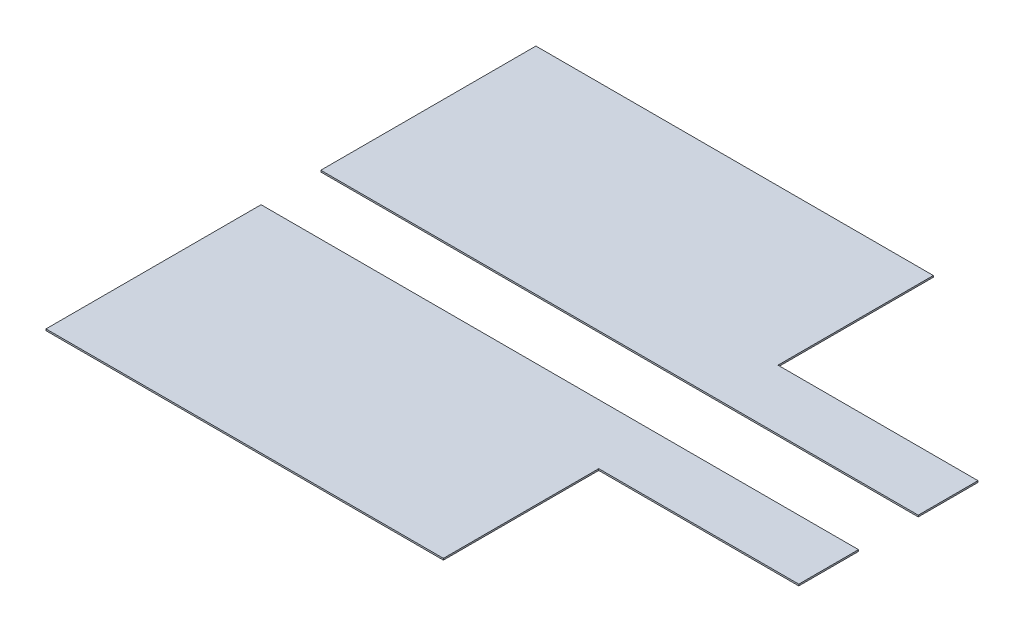
ISO-10303-21;
HEADER;
FILE_DESCRIPTION(('STEP AP214'),'2;1');
FILE_NAME('part.step','',(''),(''),'','','');
FILE_SCHEMA(('AUTOMOTIVE_DESIGN { 1 0 10303 214 1 1 1 1 }'));
ENDSEC;
DATA;
#1=APPLICATION_CONTEXT('core data for automotive mechanical design processes');
#2=APPLICATION_PROTOCOL_DEFINITION('international standard','automotive_design',2000,#1);
#3=PRODUCT_CONTEXT('',#1,'mechanical');
#4=PRODUCT('Part','Part','',(#3));
#5=PRODUCT_RELATED_PRODUCT_CATEGORY('part','',(#4));
#6=PRODUCT_DEFINITION_FORMATION('','',#4);
#7=PRODUCT_DEFINITION_CONTEXT('part definition',#1,'design');
#8=PRODUCT_DEFINITION('design','',#6,#7);
#9=PRODUCT_DEFINITION_SHAPE('','',#8);
#10=(LENGTH_UNIT() NAMED_UNIT(*) SI_UNIT(.MILLI.,.METRE.));
#11=(NAMED_UNIT(*) PLANE_ANGLE_UNIT() SI_UNIT($,.RADIAN.));
#12=(NAMED_UNIT(*) SI_UNIT($,.STERADIAN.) SOLID_ANGLE_UNIT());
#13=UNCERTAINTY_MEASURE_WITH_UNIT(LENGTH_MEASURE(1.E-05),#10,'distance_accuracy_value','');
#14=(GEOMETRIC_REPRESENTATION_CONTEXT(3) GLOBAL_UNCERTAINTY_ASSIGNED_CONTEXT((#13)) GLOBAL_UNIT_ASSIGNED_CONTEXT((#10,
#11,#12)) REPRESENTATION_CONTEXT('',''));
#15=CARTESIAN_POINT('',(0.,0.,0.));
#16=DIRECTION('',(0.,0.,1.));
#17=DIRECTION('',(1.,0.,0.));
#18=AXIS2_PLACEMENT_3D('',#15,#16,#17);
#19=CARTESIAN_POINT('',(0.,0.0666,10.25));
#20=DIRECTION('',(1.,0.,0.));
#21=DIRECTION('',(0.,0.,-1.));
#22=AXIS2_PLACEMENT_3D('',#19,#20,#21);
#23=PLANE('',#22);
#24=DIRECTION('',(0.,0.,1.));
#25=VECTOR('',#24,1.);
#26=CARTESIAN_POINT('',(0.,0.,10.25));
#27=LINE('',#26,#25);
#28=CARTESIAN_POINT('',(0.,0.,1.25));
#29=VERTEX_POINT('',#28);
#30=CARTESIAN_POINT('',(0.,0.,10.25));
#31=VERTEX_POINT('',#30);
#32=EDGE_CURVE('E133',#29,#31,#27,.T.);
#33=ORIENTED_EDGE('',*,*,#32,.T.);
#34=DIRECTION('',(0.,-1.,0.));
#35=VECTOR('',#34,1.);
#36=CARTESIAN_POINT('',(0.,0.0666,10.25));
#37=LINE('',#36,#35);
#38=CARTESIAN_POINT('',(0.,0.0666,10.25));
#39=VERTEX_POINT('',#38);
#40=EDGE_CURVE('E12',#39,#31,#37,.T.);
#41=ORIENTED_EDGE('',*,*,#40,.F.);
#42=DIRECTION('',(0.,0.,1.));
#43=VECTOR('',#42,1.);
#44=CARTESIAN_POINT('',(0.,0.0666,10.25));
#45=LINE('',#44,#43);
#46=CARTESIAN_POINT('',(0.,0.0666,1.25));
#47=VERTEX_POINT('',#46);
#48=EDGE_CURVE('E143',#47,#39,#45,.T.);
#49=ORIENTED_EDGE('',*,*,#48,.F.);
#50=DIRECTION('',(0.,-1.,0.));
#51=VECTOR('',#50,1.);
#52=CARTESIAN_POINT('',(0.,0.0666,1.25));
#53=LINE('',#52,#51);
#54=EDGE_CURVE('E129',#47,#29,#53,.T.);
#55=ORIENTED_EDGE('',*,*,#54,.T.);
#56=EDGE_LOOP('',(#33,#41,#49,#55));
#57=FACE_BOUND('',#56,.T.);
#58=ADVANCED_FACE('F49',(#57),#23,.F.);
#59=CARTESIAN_POINT('',(16.63,0.0666,10.25));
#60=DIRECTION('',(0.,0.,-1.));
#61=DIRECTION('',(-1.,0.,0.));
#62=AXIS2_PLACEMENT_3D('',#59,#60,#61);
#63=PLANE('',#62);
#64=DIRECTION('',(1.,0.,0.));
#65=VECTOR('',#64,1.);
#66=CARTESIAN_POINT('',(16.63,0.,10.25));
#67=LINE('',#66,#65);
#68=CARTESIAN_POINT('',(16.63,0.,10.25));
#69=VERTEX_POINT('',#68);
#70=EDGE_CURVE('E136',#31,#69,#67,.T.);
#71=ORIENTED_EDGE('',*,*,#70,.T.);
#72=DIRECTION('',(0.,-1.,0.));
#73=VECTOR('',#72,1.);
#74=CARTESIAN_POINT('',(16.63,0.0666,10.25));
#75=LINE('',#74,#73);
#76=CARTESIAN_POINT('',(16.63,0.0666,10.25));
#77=VERTEX_POINT('',#76);
#78=EDGE_CURVE('E57',#77,#69,#75,.T.);
#79=ORIENTED_EDGE('',*,*,#78,.F.);
#80=DIRECTION('',(1.,0.,0.));
#81=VECTOR('',#80,1.);
#82=CARTESIAN_POINT('',(16.63,0.0666,10.25));
#83=LINE('',#82,#81);
#84=EDGE_CURVE('E102',#39,#77,#83,.T.);
#85=ORIENTED_EDGE('',*,*,#84,.F.);
#86=ORIENTED_EDGE('',*,*,#40,.T.);
#87=EDGE_LOOP('',(#71,#79,#85,#86));
#88=FACE_BOUND('',#87,.T.);
#89=ADVANCED_FACE('F167',(#88),#63,.F.);
#90=CARTESIAN_POINT('',(16.63,0.0666,3.75));
#91=DIRECTION('',(-1.,0.,0.));
#92=DIRECTION('',(0.,0.,1.));
#93=AXIS2_PLACEMENT_3D('',#90,#91,#92);
#94=PLANE('',#93);
#95=DIRECTION('',(0.,0.,-1.));
#96=VECTOR('',#95,1.);
#97=CARTESIAN_POINT('',(16.63,0.,3.75));
#98=LINE('',#97,#96);
#99=CARTESIAN_POINT('',(16.63,0.,3.75));
#100=VERTEX_POINT('',#99);
#101=EDGE_CURVE('E138',#69,#100,#98,.T.);
#102=ORIENTED_EDGE('',*,*,#101,.T.);
#103=DIRECTION('',(0.,-1.,0.));
#104=VECTOR('',#103,1.);
#105=CARTESIAN_POINT('',(16.63,0.0666,3.75));
#106=LINE('',#105,#104);
#107=CARTESIAN_POINT('',(16.63,0.0666,3.75));
#108=VERTEX_POINT('',#107);
#109=EDGE_CURVE('E124',#108,#100,#106,.T.);
#110=ORIENTED_EDGE('',*,*,#109,.F.);
#111=DIRECTION('',(0.,0.,-1.));
#112=VECTOR('',#111,1.);
#113=CARTESIAN_POINT('',(16.63,0.0666,3.75));
#114=LINE('',#113,#112);
#115=EDGE_CURVE('E115',#77,#108,#114,.T.);
#116=ORIENTED_EDGE('',*,*,#115,.F.);
#117=ORIENTED_EDGE('',*,*,#78,.T.);
#118=EDGE_LOOP('',(#102,#110,#116,#117));
#119=FACE_BOUND('',#118,.T.);
#120=ADVANCED_FACE('F149',(#119),#94,.F.);
#121=CARTESIAN_POINT('',(25.,0.0666,3.75));
#122=DIRECTION('',(0.,0.,-1.));
#123=DIRECTION('',(-1.,0.,0.));
#124=AXIS2_PLACEMENT_3D('',#121,#122,#123);
#125=PLANE('',#124);
#126=DIRECTION('',(1.,0.,0.));
#127=VECTOR('',#126,1.);
#128=CARTESIAN_POINT('',(25.,0.,3.75));
#129=LINE('',#128,#127);
#130=CARTESIAN_POINT('',(25.,0.,3.75));
#131=VERTEX_POINT('',#130);
#132=EDGE_CURVE('E123',#100,#131,#129,.T.);
#133=ORIENTED_EDGE('',*,*,#132,.T.);
#134=DIRECTION('',(0.,-1.,0.));
#135=VECTOR('',#134,1.);
#136=CARTESIAN_POINT('',(25.,0.0666,3.75));
#137=LINE('',#136,#135);
#138=CARTESIAN_POINT('',(25.,0.0666,3.75));
#139=VERTEX_POINT('',#138);
#140=EDGE_CURVE('E120',#139,#131,#137,.T.);
#141=ORIENTED_EDGE('',*,*,#140,.F.);
#142=DIRECTION('',(1.,0.,0.));
#143=VECTOR('',#142,1.);
#144=CARTESIAN_POINT('',(25.,0.0666,3.75));
#145=LINE('',#144,#143);
#146=EDGE_CURVE('E109',#108,#139,#145,.T.);
#147=ORIENTED_EDGE('',*,*,#146,.F.);
#148=ORIENTED_EDGE('',*,*,#109,.T.);
#149=EDGE_LOOP('',(#133,#141,#147,#148));
#150=FACE_BOUND('',#149,.T.);
#151=ADVANCED_FACE('F121',(#150),#125,.F.);
#152=CARTESIAN_POINT('',(25.,0.0666,1.25));
#153=DIRECTION('',(-1.,0.,0.));
#154=DIRECTION('',(0.,0.,1.));
#155=AXIS2_PLACEMENT_3D('',#152,#153,#154);
#156=PLANE('',#155);
#157=DIRECTION('',(0.,0.,-1.));
#158=VECTOR('',#157,1.);
#159=CARTESIAN_POINT('',(25.,0.,1.25));
#160=LINE('',#159,#158);
#161=CARTESIAN_POINT('',(25.,0.,1.25));
#162=VERTEX_POINT('',#161);
#163=EDGE_CURVE('E88',#131,#162,#160,.T.);
#164=ORIENTED_EDGE('',*,*,#163,.T.);
#165=DIRECTION('',(0.,-1.,0.));
#166=VECTOR('',#165,1.);
#167=CARTESIAN_POINT('',(25.,0.0666,1.25));
#168=LINE('',#167,#166);
#169=CARTESIAN_POINT('',(25.,0.0666,1.25));
#170=VERTEX_POINT('',#169);
#171=EDGE_CURVE('E125',#170,#162,#168,.T.);
#172=ORIENTED_EDGE('',*,*,#171,.F.);
#173=DIRECTION('',(0.,0.,-1.));
#174=VECTOR('',#173,1.);
#175=CARTESIAN_POINT('',(25.,0.0666,1.25));
#176=LINE('',#175,#174);
#177=EDGE_CURVE('E113',#139,#170,#176,.T.);
#178=ORIENTED_EDGE('',*,*,#177,.F.);
#179=ORIENTED_EDGE('',*,*,#140,.T.);
#180=EDGE_LOOP('',(#164,#172,#178,#179));
#181=FACE_BOUND('',#180,.T.);
#182=ADVANCED_FACE('F127',(#181),#156,.F.);
#183=CARTESIAN_POINT('',(0.,0.0666,1.25));
#184=DIRECTION('',(0.,0.,1.));
#185=DIRECTION('',(1.,0.,0.));
#186=AXIS2_PLACEMENT_3D('',#183,#184,#185);
#187=PLANE('',#186);
#188=DIRECTION('',(-1.,0.,0.));
#189=VECTOR('',#188,1.);
#190=CARTESIAN_POINT('',(0.,0.,1.25));
#191=LINE('',#190,#189);
#192=EDGE_CURVE('E94',#162,#29,#191,.T.);
#193=ORIENTED_EDGE('',*,*,#192,.T.);
#194=ORIENTED_EDGE('',*,*,#54,.F.);
#195=DIRECTION('',(-1.,0.,0.));
#196=VECTOR('',#195,1.);
#197=CARTESIAN_POINT('',(0.,0.0666,1.25));
#198=LINE('',#197,#196);
#199=EDGE_CURVE('E65',#170,#47,#198,.T.);
#200=ORIENTED_EDGE('',*,*,#199,.F.);
#201=ORIENTED_EDGE('',*,*,#171,.T.);
#202=EDGE_LOOP('',(#193,#194,#200,#201));
#203=FACE_BOUND('',#202,.T.);
#204=ADVANCED_FACE('F156',(#203),#187,.F.);
#205=CARTESIAN_POINT('',(0.,0.0666,0.));
#206=DIRECTION('',(0.,-1.,0.));
#207=DIRECTION('',(0.,0.,-1.));
#208=AXIS2_PLACEMENT_3D('',#205,#206,#207);
#209=PLANE('',#208);
#210=ORIENTED_EDGE('',*,*,#48,.T.);
#211=ORIENTED_EDGE('',*,*,#84,.T.);
#212=ORIENTED_EDGE('',*,*,#115,.T.);
#213=ORIENTED_EDGE('',*,*,#146,.T.);
#214=ORIENTED_EDGE('',*,*,#177,.T.);
#215=ORIENTED_EDGE('',*,*,#199,.T.);
#216=EDGE_LOOP('',(#210,#211,#212,#213,#214,#215));
#217=FACE_BOUND('',#216,.T.);
#218=ADVANCED_FACE('F111',(#217),#209,.F.);
#219=CARTESIAN_POINT('',(0.,0.,0.));
#220=DIRECTION('',(0.,-1.,0.));
#221=DIRECTION('',(0.,0.,-1.));
#222=AXIS2_PLACEMENT_3D('',#219,#220,#221);
#223=PLANE('',#222);
#224=ORIENTED_EDGE('',*,*,#32,.F.);
#225=ORIENTED_EDGE('',*,*,#192,.F.);
#226=ORIENTED_EDGE('',*,*,#163,.F.);
#227=ORIENTED_EDGE('',*,*,#132,.F.);
#228=ORIENTED_EDGE('',*,*,#101,.F.);
#229=ORIENTED_EDGE('',*,*,#70,.F.);
#230=EDGE_LOOP('',(#224,#225,#226,#227,#228,#229));
#231=FACE_BOUND('',#230,.T.);
#232=ADVANCED_FACE('F152',(#231),#223,.T.);
#233=CLOSED_SHELL('',(#58,#89,#120,#151,#182,#204,#218,#232));
#234=MANIFOLD_SOLID_BREP('B2',#233);
#235=CARTESIAN_POINT('',(0.,0.0666,-10.25));
#236=DIRECTION('',(1.,0.,0.));
#237=DIRECTION('',(0.,0.,-1.));
#238=AXIS2_PLACEMENT_3D('',#235,#236,#237);
#239=PLANE('',#238);
#240=DIRECTION('',(0.,0.,1.));
#241=VECTOR('',#240,1.);
#242=CARTESIAN_POINT('',(0.,0.,-10.25));
#243=LINE('',#242,#241);
#244=CARTESIAN_POINT('',(0.,0.,-10.25));
#245=VERTEX_POINT('',#244);
#246=CARTESIAN_POINT('',(0.,0.,-1.25));
#247=VERTEX_POINT('',#246);
#248=EDGE_CURVE('E314',#245,#247,#243,.T.);
#249=ORIENTED_EDGE('',*,*,#248,.T.);
#250=DIRECTION('',(0.,-1.,0.));
#251=VECTOR('',#250,1.);
#252=CARTESIAN_POINT('',(0.,0.0666,-1.25));
#253=LINE('',#252,#251);
#254=CARTESIAN_POINT('',(0.,0.0666,-1.25));
#255=VERTEX_POINT('',#254);
#256=EDGE_CURVE('E47',#255,#247,#253,.T.);
#257=ORIENTED_EDGE('',*,*,#256,.F.);
#258=DIRECTION('',(0.,0.,1.));
#259=VECTOR('',#258,1.);
#260=CARTESIAN_POINT('',(0.,0.0666,-10.25));
#261=LINE('',#260,#259);
#262=CARTESIAN_POINT('',(0.,0.0666,-10.25));
#263=VERTEX_POINT('',#262);
#264=EDGE_CURVE('E330',#263,#255,#261,.T.);
#265=ORIENTED_EDGE('',*,*,#264,.F.);
#266=DIRECTION('',(0.,-1.,0.));
#267=VECTOR('',#266,1.);
#268=CARTESIAN_POINT('',(0.,0.0666,-10.25));
#269=LINE('',#268,#267);
#270=EDGE_CURVE('E310',#263,#245,#269,.T.);
#271=ORIENTED_EDGE('',*,*,#270,.T.);
#272=EDGE_LOOP('',(#249,#257,#265,#271));
#273=FACE_BOUND('',#272,.T.);
#274=ADVANCED_FACE('F225',(#273),#239,.F.);
#275=CARTESIAN_POINT('',(0.,0.0666,-1.25));
#276=DIRECTION('',(0.,0.,-1.));
#277=DIRECTION('',(-1.,0.,0.));
#278=AXIS2_PLACEMENT_3D('',#275,#276,#277);
#279=PLANE('',#278);
#280=DIRECTION('',(1.,0.,0.));
#281=VECTOR('',#280,1.);
#282=CARTESIAN_POINT('',(0.,0.,-1.25));
#283=LINE('',#282,#281);
#284=CARTESIAN_POINT('',(25.,0.,-1.25));
#285=VERTEX_POINT('',#284);
#286=EDGE_CURVE('E318',#247,#285,#283,.T.);
#287=ORIENTED_EDGE('',*,*,#286,.T.);
#288=DIRECTION('',(0.,-1.,0.));
#289=VECTOR('',#288,1.);
#290=CARTESIAN_POINT('',(25.,0.0666,-1.25));
#291=LINE('',#290,#289);
#292=CARTESIAN_POINT('',(25.,0.0666,-1.25));
#293=VERTEX_POINT('',#292);
#294=EDGE_CURVE('E234',#293,#285,#291,.T.);
#295=ORIENTED_EDGE('',*,*,#294,.F.);
#296=DIRECTION('',(1.,0.,0.));
#297=VECTOR('',#296,1.);
#298=CARTESIAN_POINT('',(0.,0.0666,-1.25));
#299=LINE('',#298,#297);
#300=EDGE_CURVE('E279',#255,#293,#299,.T.);
#301=ORIENTED_EDGE('',*,*,#300,.F.);
#302=ORIENTED_EDGE('',*,*,#256,.T.);
#303=EDGE_LOOP('',(#287,#295,#301,#302));
#304=FACE_BOUND('',#303,.T.);
#305=ADVANCED_FACE('F358',(#304),#279,.F.);
#306=CARTESIAN_POINT('',(25.,0.0666,-1.25));
#307=DIRECTION('',(-1.,0.,0.));
#308=DIRECTION('',(0.,0.,1.));
#309=AXIS2_PLACEMENT_3D('',#306,#307,#308);
#310=PLANE('',#309);
#311=DIRECTION('',(0.,0.,-1.));
#312=VECTOR('',#311,1.);
#313=CARTESIAN_POINT('',(25.,0.,-1.25));
#314=LINE('',#313,#312);
#315=CARTESIAN_POINT('',(25.,0.,-3.75));
#316=VERTEX_POINT('',#315);
#317=EDGE_CURVE('E321',#285,#316,#314,.T.);
#318=ORIENTED_EDGE('',*,*,#317,.T.);
#319=DIRECTION('',(0.,-1.,0.));
#320=VECTOR('',#319,1.);
#321=CARTESIAN_POINT('',(25.,0.0666,-3.75));
#322=LINE('',#321,#320);
#323=CARTESIAN_POINT('',(25.,0.0666,-3.75));
#324=VERTEX_POINT('',#323);
#325=EDGE_CURVE('E303',#324,#316,#322,.T.);
#326=ORIENTED_EDGE('',*,*,#325,.F.);
#327=DIRECTION('',(0.,0.,-1.));
#328=VECTOR('',#327,1.);
#329=CARTESIAN_POINT('',(25.,0.0666,-1.25));
#330=LINE('',#329,#328);
#331=EDGE_CURVE('E292',#293,#324,#330,.T.);
#332=ORIENTED_EDGE('',*,*,#331,.F.);
#333=ORIENTED_EDGE('',*,*,#294,.T.);
#334=EDGE_LOOP('',(#318,#326,#332,#333));
#335=FACE_BOUND('',#334,.T.);
#336=ADVANCED_FACE('F340',(#335),#310,.F.);
#337=CARTESIAN_POINT('',(25.,0.0666,-3.75));
#338=DIRECTION('',(0.,0.,1.));
#339=DIRECTION('',(1.,0.,0.));
#340=AXIS2_PLACEMENT_3D('',#337,#338,#339);
#341=PLANE('',#340);
#342=DIRECTION('',(-1.,0.,0.));
#343=VECTOR('',#342,1.);
#344=CARTESIAN_POINT('',(25.,0.,-3.75));
#345=LINE('',#344,#343);
#346=CARTESIAN_POINT('',(16.63,0.,-3.75));
#347=VERTEX_POINT('',#346);
#348=EDGE_CURVE('E301',#316,#347,#345,.T.);
#349=ORIENTED_EDGE('',*,*,#348,.T.);
#350=DIRECTION('',(0.,-1.,0.));
#351=VECTOR('',#350,1.);
#352=CARTESIAN_POINT('',(16.63,0.0666,-3.75));
#353=LINE('',#352,#351);
#354=CARTESIAN_POINT('',(16.63,0.0666,-3.75));
#355=VERTEX_POINT('',#354);
#356=EDGE_CURVE('E298',#355,#347,#353,.T.);
#357=ORIENTED_EDGE('',*,*,#356,.F.);
#358=DIRECTION('',(-1.,0.,0.));
#359=VECTOR('',#358,1.);
#360=CARTESIAN_POINT('',(25.,0.0666,-3.75));
#361=LINE('',#360,#359);
#362=EDGE_CURVE('E286',#324,#355,#361,.T.);
#363=ORIENTED_EDGE('',*,*,#362,.F.);
#364=ORIENTED_EDGE('',*,*,#325,.T.);
#365=EDGE_LOOP('',(#349,#357,#363,#364));
#366=FACE_BOUND('',#365,.T.);
#367=ADVANCED_FACE('F299',(#366),#341,.F.);
#368=CARTESIAN_POINT('',(16.63,0.0666,-3.75));
#369=DIRECTION('',(-1.,0.,0.));
#370=DIRECTION('',(0.,0.,1.));
#371=AXIS2_PLACEMENT_3D('',#368,#369,#370);
#372=PLANE('',#371);
#373=DIRECTION('',(0.,0.,-1.));
#374=VECTOR('',#373,1.);
#375=CARTESIAN_POINT('',(16.63,0.,-3.75));
#376=LINE('',#375,#374);
#377=CARTESIAN_POINT('',(16.63,0.,-10.25));
#378=VERTEX_POINT('',#377);
#379=EDGE_CURVE('E265',#347,#378,#376,.T.);
#380=ORIENTED_EDGE('',*,*,#379,.T.);
#381=DIRECTION('',(0.,-1.,0.));
#382=VECTOR('',#381,1.);
#383=CARTESIAN_POINT('',(16.63,0.0666,-10.25));
#384=LINE('',#383,#382);
#385=CARTESIAN_POINT('',(16.63,0.0666,-10.25));
#386=VERTEX_POINT('',#385);
#387=EDGE_CURVE('E304',#386,#378,#384,.T.);
#388=ORIENTED_EDGE('',*,*,#387,.F.);
#389=DIRECTION('',(0.,0.,-1.));
#390=VECTOR('',#389,1.);
#391=CARTESIAN_POINT('',(16.63,0.0666,-3.75));
#392=LINE('',#391,#390);
#393=EDGE_CURVE('E290',#355,#386,#392,.T.);
#394=ORIENTED_EDGE('',*,*,#393,.F.);
#395=ORIENTED_EDGE('',*,*,#356,.T.);
#396=EDGE_LOOP('',(#380,#388,#394,#395));
#397=FACE_BOUND('',#396,.T.);
#398=ADVANCED_FACE('F306',(#397),#372,.F.);
#399=CARTESIAN_POINT('',(16.63,0.0666,-10.25));
#400=DIRECTION('',(0.,0.,1.));
#401=DIRECTION('',(1.,0.,0.));
#402=AXIS2_PLACEMENT_3D('',#399,#400,#401);
#403=PLANE('',#402);
#404=DIRECTION('',(-1.,0.,0.));
#405=VECTOR('',#404,1.);
#406=CARTESIAN_POINT('',(16.63,0.,-10.25));
#407=LINE('',#406,#405);
#408=EDGE_CURVE('E271',#378,#245,#407,.T.);
#409=ORIENTED_EDGE('',*,*,#408,.T.);
#410=ORIENTED_EDGE('',*,*,#270,.F.);
#411=DIRECTION('',(-1.,0.,0.));
#412=VECTOR('',#411,1.);
#413=CARTESIAN_POINT('',(16.63,0.0666,-10.25));
#414=LINE('',#413,#412);
#415=EDGE_CURVE('E242',#386,#263,#414,.T.);
#416=ORIENTED_EDGE('',*,*,#415,.F.);
#417=ORIENTED_EDGE('',*,*,#387,.T.);
#418=EDGE_LOOP('',(#409,#410,#416,#417));
#419=FACE_BOUND('',#418,.T.);
#420=ADVANCED_FACE('F347',(#419),#403,.F.);
#421=CARTESIAN_POINT('',(0.,0.0666,0.));
#422=DIRECTION('',(0.,1.,0.));
#423=DIRECTION('',(0.,0.,1.));
#424=AXIS2_PLACEMENT_3D('',#421,#422,#423);
#425=PLANE('',#424);
#426=ORIENTED_EDGE('',*,*,#264,.T.);
#427=ORIENTED_EDGE('',*,*,#300,.T.);
#428=ORIENTED_EDGE('',*,*,#331,.T.);
#429=ORIENTED_EDGE('',*,*,#362,.T.);
#430=ORIENTED_EDGE('',*,*,#393,.T.);
#431=ORIENTED_EDGE('',*,*,#415,.T.);
#432=EDGE_LOOP('',(#426,#427,#428,#429,#430,#431));
#433=FACE_BOUND('',#432,.T.);
#434=ADVANCED_FACE('F288',(#433),#425,.T.);
#435=CARTESIAN_POINT('',(0.,0.,0.));
#436=DIRECTION('',(0.,1.,0.));
#437=DIRECTION('',(0.,0.,1.));
#438=AXIS2_PLACEMENT_3D('',#435,#436,#437);
#439=PLANE('',#438);
#440=ORIENTED_EDGE('',*,*,#248,.F.);
#441=ORIENTED_EDGE('',*,*,#408,.F.);
#442=ORIENTED_EDGE('',*,*,#379,.F.);
#443=ORIENTED_EDGE('',*,*,#348,.F.);
#444=ORIENTED_EDGE('',*,*,#317,.F.);
#445=ORIENTED_EDGE('',*,*,#286,.F.);
#446=EDGE_LOOP('',(#440,#441,#442,#443,#444,#445));
#447=FACE_BOUND('',#446,.T.);
#448=ADVANCED_FACE('F343',(#447),#439,.F.);
#449=CLOSED_SHELL('',(#274,#305,#336,#367,#398,#420,#434,#448));
#450=MANIFOLD_SOLID_BREP('B6',#449);
#451=ADVANCED_BREP_SHAPE_REPRESENTATION('',(#18,#234,#450),#14);
#452=SHAPE_DEFINITION_REPRESENTATION(#9,#451);
ENDSEC;
END-ISO-10303-21;
